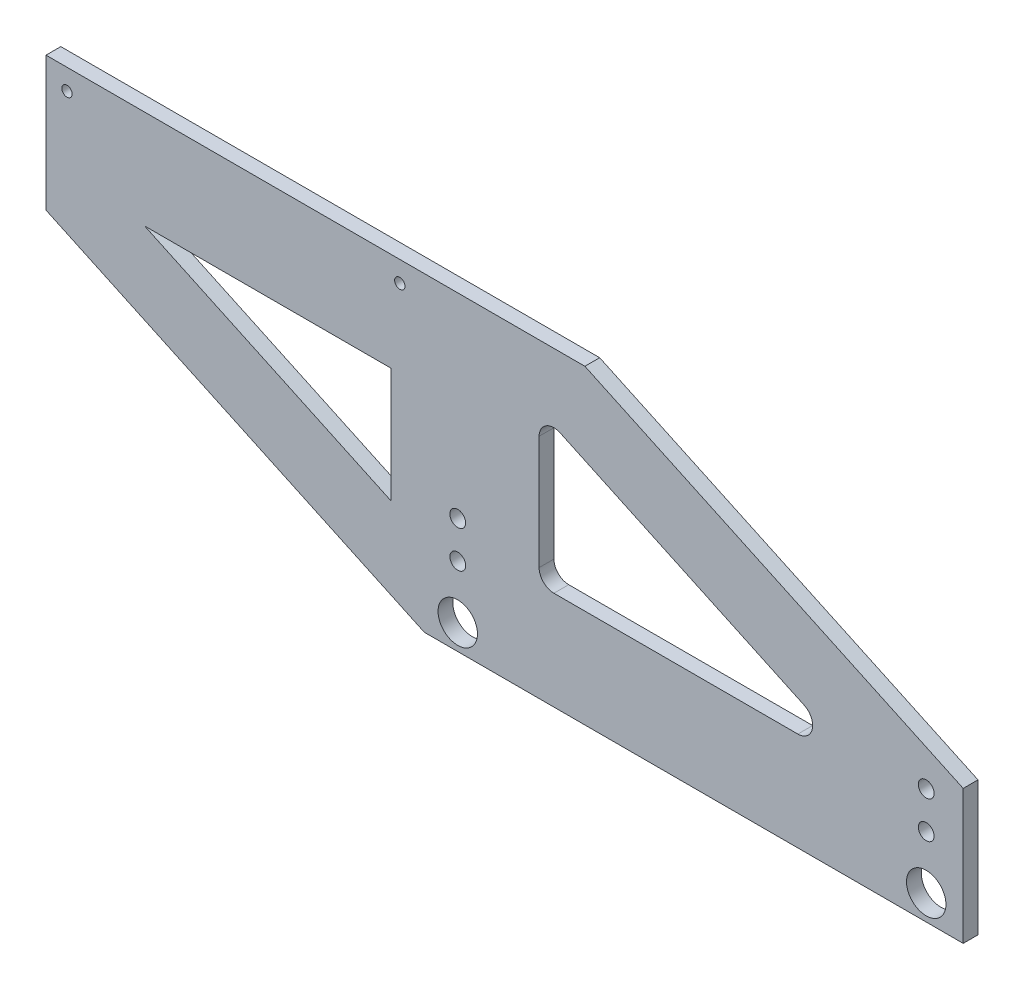
ISO-10303-21;
HEADER;
FILE_DESCRIPTION(('STEP AP214'),'2;1');
FILE_NAME('part.step','',(''),(''),'','','');
FILE_SCHEMA(('AUTOMOTIVE_DESIGN { 1 0 10303 214 1 1 1 1 }'));
ENDSEC;
DATA;
#1=APPLICATION_CONTEXT('core data for automotive mechanical design processes');
#2=APPLICATION_PROTOCOL_DEFINITION('international standard','automotive_design',2000,#1);
#3=PRODUCT_CONTEXT('',#1,'mechanical');
#4=PRODUCT('Part','Part','',(#3));
#5=PRODUCT_RELATED_PRODUCT_CATEGORY('part','',(#4));
#6=PRODUCT_DEFINITION_FORMATION('','',#4);
#7=PRODUCT_DEFINITION_CONTEXT('part definition',#1,'design');
#8=PRODUCT_DEFINITION('design','',#6,#7);
#9=PRODUCT_DEFINITION_SHAPE('','',#8);
#10=(LENGTH_UNIT() NAMED_UNIT(*) SI_UNIT(.MILLI.,.METRE.));
#11=(NAMED_UNIT(*) PLANE_ANGLE_UNIT() SI_UNIT($,.RADIAN.));
#12=(NAMED_UNIT(*) SI_UNIT($,.STERADIAN.) SOLID_ANGLE_UNIT());
#13=UNCERTAINTY_MEASURE_WITH_UNIT(LENGTH_MEASURE(1.E-05),#10,'distance_accuracy_value','');
#14=(GEOMETRIC_REPRESENTATION_CONTEXT(3) GLOBAL_UNCERTAINTY_ASSIGNED_CONTEXT((#13)) GLOBAL_UNIT_ASSIGNED_CONTEXT((#10,
#11,#12)) REPRESENTATION_CONTEXT('',''));
#15=CARTESIAN_POINT('',(0.,0.,0.));
#16=DIRECTION('',(0.,0.,1.));
#17=DIRECTION('',(1.,0.,0.));
#18=AXIS2_PLACEMENT_3D('',#15,#16,#17);
#19=CARTESIAN_POINT('',(0.,0.,3.));
#20=DIRECTION('',(0.,0.,1.));
#21=DIRECTION('',(1.,0.,0.));
#22=AXIS2_PLACEMENT_3D('',#19,#20,#21);
#23=PLANE('',#22);
#24=CARTESIAN_POINT('',(0.,34.4999999999958,3.));
#25=DIRECTION('',(0.,0.,1.));
#26=DIRECTION('',(1.,0.,0.));
#27=AXIS2_PLACEMENT_3D('',#24,#25,#26);
#28=CIRCLE('',#27,1.6);
#29=CARTESIAN_POINT('',(1.6,34.4999999999958,3.));
#30=VERTEX_POINT('',#29);
#31=EDGE_CURVE('E280',#30,#30,#28,.T.);
#32=ORIENTED_EDGE('',*,*,#31,.F.);
#33=EDGE_LOOP('',(#32));
#34=FACE_BOUND('',#33,.T.);
#35=CARTESIAN_POINT('',(95.,26.9999999999978,3.));
#36=DIRECTION('',(0.,0.,1.));
#37=DIRECTION('',(1.,0.,0.));
#38=AXIS2_PLACEMENT_3D('',#35,#36,#37);
#39=CIRCLE('',#38,1.6);
#40=CARTESIAN_POINT('',(96.6,26.9999999999978,3.));
#41=VERTEX_POINT('',#40);
#42=EDGE_CURVE('E292',#41,#41,#39,.T.);
#43=ORIENTED_EDGE('',*,*,#42,.F.);
#44=EDGE_LOOP('',(#43));
#45=FACE_BOUND('',#44,.T.);
#46=CARTESIAN_POINT('',(0.,16.2018540583964,3.));
#47=DIRECTION('',(0.,0.,1.));
#48=DIRECTION('',(1.,0.,0.));
#49=AXIS2_PLACEMENT_3D('',#46,#47,#48);
#50=CIRCLE('',#49,4.);
#51=CARTESIAN_POINT('',(4.,16.2018540583964,3.));
#52=VERTEX_POINT('',#51);
#53=EDGE_CURVE('E304',#52,#52,#50,.T.);
#54=ORIENTED_EDGE('',*,*,#53,.F.);
#55=EDGE_LOOP('',(#54));
#56=FACE_BOUND('',#55,.T.);
#57=CARTESIAN_POINT('',(-79.25,69.9154273187985,3.));
#58=DIRECTION('',(0.,0.,1.));
#59=DIRECTION('',(1.,0.,0.));
#60=AXIS2_PLACEMENT_3D('',#57,#58,#59);
#61=CIRCLE('',#60,1.04999999999999);
#62=CARTESIAN_POINT('',(-78.2,69.9154273187985,3.));
#63=VERTEX_POINT('',#62);
#64=EDGE_CURVE('E173',#63,#63,#61,.T.);
#65=ORIENTED_EDGE('',*,*,#64,.F.);
#66=EDGE_LOOP('',(#65));
#67=FACE_BOUND('',#66,.T.);
#68=DIRECTION('',(0.,-1.,0.));
#69=VECTOR('',#68,1.);
#70=CARTESIAN_POINT('',(-83.5000000000005,74.1154273187985,3.));
#71=LINE('',#70,#69);
#72=CARTESIAN_POINT('',(-83.5000000000005,74.1154273187985,3.));
#73=VERTEX_POINT('',#72);
#74=CARTESIAN_POINT('',(-83.5000000000005,46.8909116974611,3.));
#75=VERTEX_POINT('',#74);
#76=EDGE_CURVE('E179',#73,#75,#71,.T.);
#77=ORIENTED_EDGE('',*,*,#76,.T.);
#78=DIRECTION('',(0.906307787036651,-0.422618261740697,0.));
#79=VECTOR('',#78,1.);
#80=CARTESIAN_POINT('',(-83.5000000000005,46.8909116974611,3.));
#81=LINE('',#80,#79);
#82=CARTESIAN_POINT('',(-6.7792261653765,11.1154273187985,3.));
#83=VERTEX_POINT('',#82);
#84=EDGE_CURVE('E182',#75,#83,#81,.T.);
#85=ORIENTED_EDGE('',*,*,#84,.T.);
#86=DIRECTION('',(1.,0.,0.));
#87=VECTOR('',#86,1.);
#88=CARTESIAN_POINT('',(-6.7792261653765,11.1154273187985,3.));
#89=LINE('',#88,#87);
#90=CARTESIAN_POINT('',(102.5,11.1154273187985,3.));
#91=VERTEX_POINT('',#90);
#92=EDGE_CURVE('E185',#83,#91,#89,.T.);
#93=ORIENTED_EDGE('',*,*,#92,.T.);
#94=DIRECTION('',(0.,1.,0.));
#95=VECTOR('',#94,1.);
#96=CARTESIAN_POINT('',(102.5,38.3399429401359,3.));
#97=LINE('',#96,#95);
#98=CARTESIAN_POINT('',(102.5,38.3399429401359,3.));
#99=VERTEX_POINT('',#98);
#100=EDGE_CURVE('E187',#91,#99,#97,.T.);
#101=ORIENTED_EDGE('',*,*,#100,.T.);
#102=DIRECTION('',(-0.906307787036651,0.422618261740697,0.));
#103=VECTOR('',#102,1.);
#104=CARTESIAN_POINT('',(25.779226165376,74.1154273187985,3.));
#105=LINE('',#104,#103);
#106=CARTESIAN_POINT('',(25.779226165376,74.1154273187985,3.));
#107=VERTEX_POINT('',#106);
#108=EDGE_CURVE('E189',#99,#107,#105,.T.);
#109=ORIENTED_EDGE('',*,*,#108,.T.);
#110=DIRECTION('',(-1.,0.,0.));
#111=VECTOR('',#110,1.);
#112=CARTESIAN_POINT('',(-83.5000000000005,74.1154273187985,3.));
#113=LINE('',#112,#111);
#114=EDGE_CURVE('E191',#107,#73,#113,.T.);
#115=ORIENTED_EDGE('',*,*,#114,.T.);
#116=EDGE_LOOP('',(#77,#85,#93,#101,#109,#115));
#117=FACE_BOUND('',#116,.T.);
#118=DIRECTION('',(0.,1.,0.));
#119=VECTOR('',#118,1.);
#120=CARTESIAN_POINT('',(-13.5000000000005,54.1154273187985,3.));
#121=LINE('',#120,#119);
#122=CARTESIAN_POINT('',(-13.5000000000005,30.8000444110487,3.));
#123=VERTEX_POINT('',#122);
#124=CARTESIAN_POINT('',(-13.5000000000005,54.1154273187985,3.));
#125=VERTEX_POINT('',#124);
#126=EDGE_CURVE('E154',#123,#125,#121,.T.);
#127=ORIENTED_EDGE('',*,*,#126,.F.);
#128=DIRECTION('',(0.906307787036651,-0.422618261740697,0.));
#129=VECTOR('',#128,1.);
#130=CARTESIAN_POINT('',(-13.5000000000005,30.8000444110487,3.));
#131=LINE('',#130,#129);
#132=CARTESIAN_POINT('',(-63.5000000000005,54.1154273187985,3.));
#133=VERTEX_POINT('',#132);
#134=EDGE_CURVE('E144',#133,#123,#131,.T.);
#135=ORIENTED_EDGE('',*,*,#134,.F.);
#136=DIRECTION('',(-1.,0.,0.));
#137=VECTOR('',#136,1.);
#138=CARTESIAN_POINT('',(-63.5000000000005,54.1154273187985,3.));
#139=LINE('',#138,#137);
#140=EDGE_CURVE('E166',#125,#133,#139,.T.);
#141=ORIENTED_EDGE('',*,*,#140,.F.);
#142=EDGE_LOOP('',(#127,#135,#141));
#143=FACE_BOUND('',#142,.T.);
#144=CARTESIAN_POINT('',(-11.75,69.9154273187985,3.));
#145=DIRECTION('',(0.,0.,1.));
#146=DIRECTION('',(1.,0.,0.));
#147=AXIS2_PLACEMENT_3D('',#144,#145,#146);
#148=CIRCLE('',#147,1.05);
#149=CARTESIAN_POINT('',(-10.7,69.9154273187985,3.));
#150=VERTEX_POINT('',#149);
#151=EDGE_CURVE('E310',#150,#150,#148,.T.);
#152=ORIENTED_EDGE('',*,*,#151,.F.);
#153=EDGE_LOOP('',(#152));
#154=FACE_BOUND('',#153,.T.);
#155=CARTESIAN_POINT('',(95.,16.2018540583964,3.));
#156=DIRECTION('',(0.,0.,1.));
#157=DIRECTION('',(1.,0.,0.));
#158=AXIS2_PLACEMENT_3D('',#155,#156,#157);
#159=CIRCLE('',#158,4.00000000000001);
#160=CARTESIAN_POINT('',(99.,16.2018540583964,3.));
#161=VERTEX_POINT('',#160);
#162=EDGE_CURVE('E298',#161,#161,#159,.T.);
#163=ORIENTED_EDGE('',*,*,#162,.F.);
#164=EDGE_LOOP('',(#163));
#165=FACE_BOUND('',#164,.T.);
#166=CARTESIAN_POINT('',(95.,34.4999999999958,3.));
#167=DIRECTION('',(0.,0.,1.));
#168=DIRECTION('',(1.,0.,0.));
#169=AXIS2_PLACEMENT_3D('',#166,#167,#168);
#170=CIRCLE('',#169,1.60000000000001);
#171=CARTESIAN_POINT('',(96.6,34.4999999999958,3.));
#172=VERTEX_POINT('',#171);
#173=EDGE_CURVE('E286',#172,#172,#170,.T.);
#174=ORIENTED_EDGE('',*,*,#173,.F.);
#175=EDGE_LOOP('',(#174));
#176=FACE_BOUND('',#175,.T.);
#177=CARTESIAN_POINT('',(0.,26.9999999999978,3.));
#178=DIRECTION('',(0.,0.,1.));
#179=DIRECTION('',(1.,0.,0.));
#180=AXIS2_PLACEMENT_3D('',#177,#178,#179);
#181=CIRCLE('',#180,1.6);
#182=CARTESIAN_POINT('',(1.6,26.9999999999978,3.));
#183=VERTEX_POINT('',#182);
#184=EDGE_CURVE('E274',#183,#183,#181,.T.);
#185=ORIENTED_EDGE('',*,*,#184,.F.);
#186=EDGE_LOOP('',(#185));
#187=FACE_BOUND('',#186,.T.);
#188=DIRECTION('',(0.,-1.,0.));
#189=VECTOR('',#188,1.);
#190=CARTESIAN_POINT('',(16.4999999999995,61.8917327570284,3.));
#191=LINE('',#190,#189);
#192=CARTESIAN_POINT('',(16.4999999999995,57.182676025676,3.));
#193=VERTEX_POINT('',#192);
#194=CARTESIAN_POINT('',(16.4999999999995,34.1154273187985,3.));
#195=VERTEX_POINT('',#194);
#196=EDGE_CURVE('E261',#193,#195,#191,.T.);
#197=ORIENTED_EDGE('',*,*,#196,.F.);
#198=CARTESIAN_POINT('',(19.4999999999995,57.182676025676,3.));
#199=DIRECTION('',(0.,0.,1.));
#200=DIRECTION('',(1.,0.,0.));
#201=AXIS2_PLACEMENT_3D('',#198,#199,#200);
#202=CIRCLE('',#201,3.);
#203=CARTESIAN_POINT('',(20.7678547852216,59.9015993867859,3.));
#204=VERTEX_POINT('',#203);
#205=EDGE_CURVE('E11',#193,#204,#202,.F.);
#206=ORIENTED_EDGE('',*,*,#205,.T.);
#207=DIRECTION('',(-0.906307787036651,0.422618261740697,0.));
#208=VECTOR('',#207,1.);
#209=CARTESIAN_POINT('',(82.5,31.1154273187985,3.));
#210=LINE('',#209,#208);
#211=CARTESIAN_POINT('',(70.2357292742359,36.8343506799084,3.));
#212=VERTEX_POINT('',#211);
#213=EDGE_CURVE('E259',#212,#204,#210,.T.);
#214=ORIENTED_EDGE('',*,*,#213,.F.);
#215=CARTESIAN_POINT('',(68.9678744890138,34.1154273187985,3.));
#216=DIRECTION('',(0.,0.,1.));
#217=DIRECTION('',(1.,0.,0.));
#218=AXIS2_PLACEMENT_3D('',#215,#216,#217);
#219=CIRCLE('',#218,3.);
#220=CARTESIAN_POINT('',(68.9678744890138,31.1154273187985,3.));
#221=VERTEX_POINT('',#220);
#222=EDGE_CURVE('E238',#212,#221,#219,.F.);
#223=ORIENTED_EDGE('',*,*,#222,.T.);
#224=DIRECTION('',(1.,0.,0.));
#225=VECTOR('',#224,1.);
#226=CARTESIAN_POINT('',(16.4999999999995,31.1154273187985,3.));
#227=LINE('',#226,#225);
#228=CARTESIAN_POINT('',(19.4999999999995,31.1154273187985,3.));
#229=VERTEX_POINT('',#228);
#230=EDGE_CURVE('E266',#229,#221,#227,.T.);
#231=ORIENTED_EDGE('',*,*,#230,.F.);
#232=CARTESIAN_POINT('',(19.4999999999995,34.1154273187985,3.));
#233=DIRECTION('',(0.,0.,1.));
#234=DIRECTION('',(1.,0.,0.));
#235=AXIS2_PLACEMENT_3D('',#232,#233,#234);
#236=CIRCLE('',#235,3.);
#237=EDGE_CURVE('E50',#229,#195,#236,.F.);
#238=ORIENTED_EDGE('',*,*,#237,.T.);
#239=EDGE_LOOP('',(#197,#206,#214,#223,#231,#238));
#240=FACE_BOUND('',#239,.T.);
#241=ADVANCED_FACE('F35',(#34,#45,#56,#67,#117,#143,#154,#165,#176,#187,#240),#23,.T.);
#242=CARTESIAN_POINT('',(0.,0.,0.));
#243=DIRECTION('',(0.,0.,1.));
#244=DIRECTION('',(1.,0.,0.));
#245=AXIS2_PLACEMENT_3D('',#242,#243,#244);
#246=PLANE('',#245);
#247=CARTESIAN_POINT('',(0.,26.9999999999978,0.));
#248=DIRECTION('',(0.,0.,1.));
#249=DIRECTION('',(1.,0.,0.));
#250=AXIS2_PLACEMENT_3D('',#247,#248,#249);
#251=CIRCLE('',#250,1.6);
#252=CARTESIAN_POINT('',(1.6,26.9999999999978,0.));
#253=VERTEX_POINT('',#252);
#254=EDGE_CURVE('E272',#253,#253,#251,.T.);
#255=ORIENTED_EDGE('',*,*,#254,.T.);
#256=EDGE_LOOP('',(#255));
#257=FACE_BOUND('',#256,.T.);
#258=CARTESIAN_POINT('',(0.,34.4999999999958,0.));
#259=DIRECTION('',(0.,0.,1.));
#260=DIRECTION('',(1.,0.,0.));
#261=AXIS2_PLACEMENT_3D('',#258,#259,#260);
#262=CIRCLE('',#261,1.6);
#263=CARTESIAN_POINT('',(1.6,34.4999999999958,0.));
#264=VERTEX_POINT('',#263);
#265=EDGE_CURVE('E277',#264,#264,#262,.T.);
#266=ORIENTED_EDGE('',*,*,#265,.T.);
#267=EDGE_LOOP('',(#266));
#268=FACE_BOUND('',#267,.T.);
#269=CARTESIAN_POINT('',(95.,34.4999999999958,0.));
#270=DIRECTION('',(0.,0.,1.));
#271=DIRECTION('',(1.,0.,0.));
#272=AXIS2_PLACEMENT_3D('',#269,#270,#271);
#273=CIRCLE('',#272,1.60000000000001);
#274=CARTESIAN_POINT('',(96.6,34.4999999999958,0.));
#275=VERTEX_POINT('',#274);
#276=EDGE_CURVE('E283',#275,#275,#273,.T.);
#277=ORIENTED_EDGE('',*,*,#276,.T.);
#278=EDGE_LOOP('',(#277));
#279=FACE_BOUND('',#278,.T.);
#280=CARTESIAN_POINT('',(95.,26.9999999999978,0.));
#281=DIRECTION('',(0.,0.,1.));
#282=DIRECTION('',(1.,0.,0.));
#283=AXIS2_PLACEMENT_3D('',#280,#281,#282);
#284=CIRCLE('',#283,1.6);
#285=CARTESIAN_POINT('',(96.6,26.9999999999978,0.));
#286=VERTEX_POINT('',#285);
#287=EDGE_CURVE('E289',#286,#286,#284,.T.);
#288=ORIENTED_EDGE('',*,*,#287,.T.);
#289=EDGE_LOOP('',(#288));
#290=FACE_BOUND('',#289,.T.);
#291=CARTESIAN_POINT('',(95.,16.2018540583964,0.));
#292=DIRECTION('',(0.,0.,1.));
#293=DIRECTION('',(1.,0.,0.));
#294=AXIS2_PLACEMENT_3D('',#291,#292,#293);
#295=CIRCLE('',#294,4.00000000000001);
#296=CARTESIAN_POINT('',(99.,16.2018540583964,0.));
#297=VERTEX_POINT('',#296);
#298=EDGE_CURVE('E295',#297,#297,#295,.T.);
#299=ORIENTED_EDGE('',*,*,#298,.T.);
#300=EDGE_LOOP('',(#299));
#301=FACE_BOUND('',#300,.T.);
#302=CARTESIAN_POINT('',(0.,16.2018540583964,0.));
#303=DIRECTION('',(0.,0.,1.));
#304=DIRECTION('',(1.,0.,0.));
#305=AXIS2_PLACEMENT_3D('',#302,#303,#304);
#306=CIRCLE('',#305,4.);
#307=CARTESIAN_POINT('',(4.,16.2018540583964,0.));
#308=VERTEX_POINT('',#307);
#309=EDGE_CURVE('E301',#308,#308,#306,.T.);
#310=ORIENTED_EDGE('',*,*,#309,.T.);
#311=EDGE_LOOP('',(#310));
#312=FACE_BOUND('',#311,.T.);
#313=CARTESIAN_POINT('',(-11.75,69.9154273187985,0.));
#314=DIRECTION('',(0.,0.,1.));
#315=DIRECTION('',(1.,0.,0.));
#316=AXIS2_PLACEMENT_3D('',#313,#314,#315);
#317=CIRCLE('',#316,1.05);
#318=CARTESIAN_POINT('',(-10.7,69.9154273187985,0.));
#319=VERTEX_POINT('',#318);
#320=EDGE_CURVE('E307',#319,#319,#317,.T.);
#321=ORIENTED_EDGE('',*,*,#320,.T.);
#322=EDGE_LOOP('',(#321));
#323=FACE_BOUND('',#322,.T.);
#324=CARTESIAN_POINT('',(-79.25,69.9154273187985,0.));
#325=DIRECTION('',(0.,0.,1.));
#326=DIRECTION('',(1.,0.,0.));
#327=AXIS2_PLACEMENT_3D('',#324,#325,#326);
#328=CIRCLE('',#327,1.04999999999999);
#329=CARTESIAN_POINT('',(-78.2,69.9154273187985,0.));
#330=VERTEX_POINT('',#329);
#331=EDGE_CURVE('E313',#330,#330,#328,.T.);
#332=ORIENTED_EDGE('',*,*,#331,.T.);
#333=EDGE_LOOP('',(#332));
#334=FACE_BOUND('',#333,.T.);
#335=DIRECTION('',(0.906307787036651,-0.422618261740697,0.));
#336=VECTOR('',#335,1.);
#337=CARTESIAN_POINT('',(-13.5000000000005,30.8000444110487,0.));
#338=LINE('',#337,#336);
#339=CARTESIAN_POINT('',(-63.5000000000005,54.1154273187985,0.));
#340=VERTEX_POINT('',#339);
#341=CARTESIAN_POINT('',(-13.5000000000005,30.8000444110487,0.));
#342=VERTEX_POINT('',#341);
#343=EDGE_CURVE('E171',#340,#342,#338,.T.);
#344=ORIENTED_EDGE('',*,*,#343,.T.);
#345=DIRECTION('',(0.,1.,0.));
#346=VECTOR('',#345,1.);
#347=CARTESIAN_POINT('',(-13.5000000000005,54.1154273187985,0.));
#348=LINE('',#347,#346);
#349=CARTESIAN_POINT('',(-13.5000000000005,54.1154273187985,0.));
#350=VERTEX_POINT('',#349);
#351=EDGE_CURVE('E161',#342,#350,#348,.T.);
#352=ORIENTED_EDGE('',*,*,#351,.T.);
#353=DIRECTION('',(-1.,0.,0.));
#354=VECTOR('',#353,1.);
#355=CARTESIAN_POINT('',(-63.5000000000005,54.1154273187985,0.));
#356=LINE('',#355,#354);
#357=EDGE_CURVE('E155',#350,#340,#356,.T.);
#358=ORIENTED_EDGE('',*,*,#357,.T.);
#359=EDGE_LOOP('',(#344,#352,#358));
#360=FACE_BOUND('',#359,.T.);
#361=DIRECTION('',(0.,-1.,0.));
#362=VECTOR('',#361,1.);
#363=CARTESIAN_POINT('',(-83.5000000000005,74.1154273187985,0.));
#364=LINE('',#363,#362);
#365=CARTESIAN_POINT('',(-83.5000000000005,74.1154273187985,0.));
#366=VERTEX_POINT('',#365);
#367=CARTESIAN_POINT('',(-83.5000000000005,46.8909116974611,0.));
#368=VERTEX_POINT('',#367);
#369=EDGE_CURVE('E162',#366,#368,#364,.T.);
#370=ORIENTED_EDGE('',*,*,#369,.F.);
#371=DIRECTION('',(-1.,0.,0.));
#372=VECTOR('',#371,1.);
#373=CARTESIAN_POINT('',(-83.5000000000005,74.1154273187985,0.));
#374=LINE('',#373,#372);
#375=CARTESIAN_POINT('',(25.779226165376,74.1154273187985,0.));
#376=VERTEX_POINT('',#375);
#377=EDGE_CURVE('E183',#376,#366,#374,.T.);
#378=ORIENTED_EDGE('',*,*,#377,.F.);
#379=DIRECTION('',(-0.906307787036651,0.422618261740697,0.));
#380=VECTOR('',#379,1.);
#381=CARTESIAN_POINT('',(25.779226165376,74.1154273187985,0.));
#382=LINE('',#381,#380);
#383=CARTESIAN_POINT('',(102.5,38.3399429401359,0.));
#384=VERTEX_POINT('',#383);
#385=EDGE_CURVE('E202',#384,#376,#382,.T.);
#386=ORIENTED_EDGE('',*,*,#385,.F.);
#387=DIRECTION('',(0.,1.,0.));
#388=VECTOR('',#387,1.);
#389=CARTESIAN_POINT('',(102.5,38.3399429401359,0.));
#390=LINE('',#389,#388);
#391=CARTESIAN_POINT('',(102.5,11.1154273187985,0.));
#392=VERTEX_POINT('',#391);
#393=EDGE_CURVE('E200',#392,#384,#390,.T.);
#394=ORIENTED_EDGE('',*,*,#393,.F.);
#395=DIRECTION('',(1.,0.,0.));
#396=VECTOR('',#395,1.);
#397=CARTESIAN_POINT('',(-6.7792261653765,11.1154273187985,0.));
#398=LINE('',#397,#396);
#399=CARTESIAN_POINT('',(-6.7792261653765,11.1154273187985,0.));
#400=VERTEX_POINT('',#399);
#401=EDGE_CURVE('E198',#400,#392,#398,.T.);
#402=ORIENTED_EDGE('',*,*,#401,.F.);
#403=DIRECTION('',(0.906307787036651,-0.422618261740697,0.));
#404=VECTOR('',#403,1.);
#405=CARTESIAN_POINT('',(-83.5000000000005,46.8909116974611,0.));
#406=LINE('',#405,#404);
#407=EDGE_CURVE('E196',#368,#400,#406,.T.);
#408=ORIENTED_EDGE('',*,*,#407,.F.);
#409=EDGE_LOOP('',(#370,#378,#386,#394,#402,#408));
#410=FACE_BOUND('',#409,.T.);
#411=DIRECTION('',(1.,0.,0.));
#412=VECTOR('',#411,1.);
#413=CARTESIAN_POINT('',(16.4999999999995,31.1154273187985,0.));
#414=LINE('',#413,#412);
#415=CARTESIAN_POINT('',(19.4999999999995,31.1154273187985,0.));
#416=VERTEX_POINT('',#415);
#417=CARTESIAN_POINT('',(68.9678744890138,31.1154273187985,0.));
#418=VERTEX_POINT('',#417);
#419=EDGE_CURVE('E254',#416,#418,#414,.T.);
#420=ORIENTED_EDGE('',*,*,#419,.T.);
#421=CARTESIAN_POINT('',(68.9678744890138,34.1154273187985,0.));
#422=DIRECTION('',(0.,0.,1.));
#423=DIRECTION('',(1.,0.,0.));
#424=AXIS2_PLACEMENT_3D('',#421,#422,#423);
#425=CIRCLE('',#424,3.);
#426=CARTESIAN_POINT('',(70.2357292742359,36.8343506799084,0.));
#427=VERTEX_POINT('',#426);
#428=EDGE_CURVE('E236',#418,#427,#425,.T.);
#429=ORIENTED_EDGE('',*,*,#428,.T.);
#430=DIRECTION('',(-0.906307787036651,0.422618261740697,0.));
#431=VECTOR('',#430,1.);
#432=CARTESIAN_POINT('',(82.5,31.1154273187985,0.));
#433=LINE('',#432,#431);
#434=CARTESIAN_POINT('',(20.7678547852216,59.9015993867859,0.));
#435=VERTEX_POINT('',#434);
#436=EDGE_CURVE('E249',#427,#435,#433,.T.);
#437=ORIENTED_EDGE('',*,*,#436,.T.);
#438=CARTESIAN_POINT('',(19.4999999999995,57.182676025676,0.));
#439=DIRECTION('',(0.,0.,1.));
#440=DIRECTION('',(1.,0.,0.));
#441=AXIS2_PLACEMENT_3D('',#438,#439,#440);
#442=CIRCLE('',#441,3.);
#443=CARTESIAN_POINT('',(16.4999999999995,57.182676025676,0.));
#444=VERTEX_POINT('',#443);
#445=EDGE_CURVE('E43',#435,#444,#442,.T.);
#446=ORIENTED_EDGE('',*,*,#445,.T.);
#447=DIRECTION('',(0.,-1.,0.));
#448=VECTOR('',#447,1.);
#449=CARTESIAN_POINT('',(16.4999999999995,61.8917327570284,0.));
#450=LINE('',#449,#448);
#451=CARTESIAN_POINT('',(16.4999999999995,34.1154273187985,0.));
#452=VERTEX_POINT('',#451);
#453=EDGE_CURVE('E247',#444,#452,#450,.T.);
#454=ORIENTED_EDGE('',*,*,#453,.T.);
#455=CARTESIAN_POINT('',(19.4999999999995,34.1154273187985,0.));
#456=DIRECTION('',(0.,0.,1.));
#457=DIRECTION('',(1.,0.,0.));
#458=AXIS2_PLACEMENT_3D('',#455,#456,#457);
#459=CIRCLE('',#458,3.);
#460=EDGE_CURVE('E240',#452,#416,#459,.T.);
#461=ORIENTED_EDGE('',*,*,#460,.T.);
#462=EDGE_LOOP('',(#420,#429,#437,#446,#454,#461));
#463=FACE_BOUND('',#462,.T.);
#464=ADVANCED_FACE('F246',(#257,#268,#279,#290,#301,#312,#323,#334,#360,#410,#463),#246,.F.);
#465=CARTESIAN_POINT('',(-83.5000000000005,74.1154273187985,3.));
#466=DIRECTION('',(1.,0.,0.));
#467=DIRECTION('',(0.,0.,-1.));
#468=AXIS2_PLACEMENT_3D('',#465,#466,#467);
#469=PLANE('',#468);
#470=ORIENTED_EDGE('',*,*,#369,.T.);
#471=DIRECTION('',(0.,0.,-1.));
#472=VECTOR('',#471,1.);
#473=CARTESIAN_POINT('',(-83.5000000000005,46.8909116974611,3.));
#474=LINE('',#473,#472);
#475=EDGE_CURVE('E219',#75,#368,#474,.T.);
#476=ORIENTED_EDGE('',*,*,#475,.F.);
#477=ORIENTED_EDGE('',*,*,#76,.F.);
#478=DIRECTION('',(0.,0.,-1.));
#479=VECTOR('',#478,1.);
#480=CARTESIAN_POINT('',(-83.5000000000005,74.1154273187985,3.));
#481=LINE('',#480,#479);
#482=EDGE_CURVE('E193',#73,#366,#481,.T.);
#483=ORIENTED_EDGE('',*,*,#482,.T.);
#484=EDGE_LOOP('',(#470,#476,#477,#483));
#485=FACE_BOUND('',#484,.T.);
#486=ADVANCED_FACE('F344',(#485),#469,.F.);
#487=CARTESIAN_POINT('',(-83.5000000000005,46.8909116974611,3.));
#488=DIRECTION('',(0.422618261740697,0.906307787036651,0.));
#489=DIRECTION('',(-0.906307787036651,0.422618261740697,0.));
#490=AXIS2_PLACEMENT_3D('',#487,#488,#489);
#491=PLANE('',#490);
#492=ORIENTED_EDGE('',*,*,#407,.T.);
#493=DIRECTION('',(0.,0.,-1.));
#494=VECTOR('',#493,1.);
#495=CARTESIAN_POINT('',(-6.7792261653765,11.1154273187985,3.));
#496=LINE('',#495,#494);
#497=EDGE_CURVE('E216',#83,#400,#496,.T.);
#498=ORIENTED_EDGE('',*,*,#497,.F.);
#499=ORIENTED_EDGE('',*,*,#84,.F.);
#500=ORIENTED_EDGE('',*,*,#475,.T.);
#501=EDGE_LOOP('',(#492,#498,#499,#500));
#502=FACE_BOUND('',#501,.T.);
#503=ADVANCED_FACE('F367',(#502),#491,.F.);
#504=CARTESIAN_POINT('',(-6.7792261653765,11.1154273187985,3.));
#505=DIRECTION('',(0.,1.,0.));
#506=DIRECTION('',(0.,0.,1.));
#507=AXIS2_PLACEMENT_3D('',#504,#505,#506);
#508=PLANE('',#507);
#509=ORIENTED_EDGE('',*,*,#401,.T.);
#510=DIRECTION('',(0.,0.,-1.));
#511=VECTOR('',#510,1.);
#512=CARTESIAN_POINT('',(102.5,11.1154273187985,3.));
#513=LINE('',#512,#511);
#514=EDGE_CURVE('E213',#91,#392,#513,.T.);
#515=ORIENTED_EDGE('',*,*,#514,.F.);
#516=ORIENTED_EDGE('',*,*,#92,.F.);
#517=ORIENTED_EDGE('',*,*,#497,.T.);
#518=EDGE_LOOP('',(#509,#515,#516,#517));
#519=FACE_BOUND('',#518,.T.);
#520=ADVANCED_FACE('F363',(#519),#508,.F.);
#521=CARTESIAN_POINT('',(102.5,38.3399429401359,3.));
#522=DIRECTION('',(-1.,0.,0.));
#523=DIRECTION('',(0.,-1.,0.));
#524=AXIS2_PLACEMENT_3D('',#521,#522,#523);
#525=PLANE('',#524);
#526=ORIENTED_EDGE('',*,*,#393,.T.);
#527=DIRECTION('',(0.,0.,-1.));
#528=VECTOR('',#527,1.);
#529=CARTESIAN_POINT('',(102.5,38.3399429401359,3.));
#530=LINE('',#529,#528);
#531=EDGE_CURVE('E210',#99,#384,#530,.T.);
#532=ORIENTED_EDGE('',*,*,#531,.F.);
#533=ORIENTED_EDGE('',*,*,#100,.F.);
#534=ORIENTED_EDGE('',*,*,#514,.T.);
#535=EDGE_LOOP('',(#526,#532,#533,#534));
#536=FACE_BOUND('',#535,.T.);
#537=ADVANCED_FACE('F359',(#536),#525,.F.);
#538=CARTESIAN_POINT('',(25.779226165376,74.1154273187985,3.));
#539=DIRECTION('',(-0.422618261740697,-0.906307787036651,0.));
#540=DIRECTION('',(0.906307787036651,-0.422618261740697,0.));
#541=AXIS2_PLACEMENT_3D('',#538,#539,#540);
#542=PLANE('',#541);
#543=ORIENTED_EDGE('',*,*,#385,.T.);
#544=DIRECTION('',(0.,0.,-1.));
#545=VECTOR('',#544,1.);
#546=CARTESIAN_POINT('',(25.779226165376,74.1154273187985,3.));
#547=LINE('',#546,#545);
#548=EDGE_CURVE('E207',#107,#376,#547,.T.);
#549=ORIENTED_EDGE('',*,*,#548,.F.);
#550=ORIENTED_EDGE('',*,*,#108,.F.);
#551=ORIENTED_EDGE('',*,*,#531,.T.);
#552=EDGE_LOOP('',(#543,#549,#550,#551));
#553=FACE_BOUND('',#552,.T.);
#554=ADVANCED_FACE('F355',(#553),#542,.F.);
#555=CARTESIAN_POINT('',(-83.5000000000005,74.1154273187985,3.));
#556=DIRECTION('',(0.,-1.,0.));
#557=DIRECTION('',(0.,0.,-1.));
#558=AXIS2_PLACEMENT_3D('',#555,#556,#557);
#559=PLANE('',#558);
#560=ORIENTED_EDGE('',*,*,#377,.T.);
#561=ORIENTED_EDGE('',*,*,#482,.F.);
#562=ORIENTED_EDGE('',*,*,#114,.F.);
#563=ORIENTED_EDGE('',*,*,#548,.T.);
#564=EDGE_LOOP('',(#560,#561,#562,#563));
#565=FACE_BOUND('',#564,.T.);
#566=ADVANCED_FACE('F352',(#565),#559,.F.);
#567=CARTESIAN_POINT('',(-13.5000000000005,30.8000444110487,3.));
#568=DIRECTION('',(0.422618261740697,0.906307787036651,0.));
#569=DIRECTION('',(-0.906307787036651,0.422618261740697,0.));
#570=AXIS2_PLACEMENT_3D('',#567,#568,#569);
#571=PLANE('',#570);
#572=ORIENTED_EDGE('',*,*,#343,.F.);
#573=DIRECTION('',(0.,0.,-1.));
#574=VECTOR('',#573,1.);
#575=CARTESIAN_POINT('',(-63.5000000000005,54.1154273187985,3.));
#576=LINE('',#575,#574);
#577=EDGE_CURVE('E150',#133,#340,#576,.T.);
#578=ORIENTED_EDGE('',*,*,#577,.F.);
#579=ORIENTED_EDGE('',*,*,#134,.T.);
#580=DIRECTION('',(0.,0.,-1.));
#581=VECTOR('',#580,1.);
#582=CARTESIAN_POINT('',(-13.5000000000005,30.8000444110487,3.));
#583=LINE('',#582,#581);
#584=EDGE_CURVE('E147',#123,#342,#583,.T.);
#585=ORIENTED_EDGE('',*,*,#584,.T.);
#586=EDGE_LOOP('',(#572,#578,#579,#585));
#587=FACE_BOUND('',#586,.T.);
#588=ADVANCED_FACE('F146',(#587),#571,.T.);
#589=CARTESIAN_POINT('',(-13.5000000000005,54.1154273187985,3.));
#590=DIRECTION('',(-1.,0.,0.));
#591=DIRECTION('',(0.,-1.,0.));
#592=AXIS2_PLACEMENT_3D('',#589,#590,#591);
#593=PLANE('',#592);
#594=ORIENTED_EDGE('',*,*,#351,.F.);
#595=ORIENTED_EDGE('',*,*,#584,.F.);
#596=ORIENTED_EDGE('',*,*,#126,.T.);
#597=DIRECTION('',(0.,0.,-1.));
#598=VECTOR('',#597,1.);
#599=CARTESIAN_POINT('',(-13.5000000000005,54.1154273187985,3.));
#600=LINE('',#599,#598);
#601=EDGE_CURVE('E163',#125,#350,#600,.T.);
#602=ORIENTED_EDGE('',*,*,#601,.T.);
#603=EDGE_LOOP('',(#594,#595,#596,#602));
#604=FACE_BOUND('',#603,.T.);
#605=ADVANCED_FACE('F159',(#604),#593,.T.);
#606=CARTESIAN_POINT('',(-63.5000000000005,54.1154273187985,3.));
#607=DIRECTION('',(0.,-1.,0.));
#608=DIRECTION('',(1.,0.,0.));
#609=AXIS2_PLACEMENT_3D('',#606,#607,#608);
#610=PLANE('',#609);
#611=ORIENTED_EDGE('',*,*,#357,.F.);
#612=ORIENTED_EDGE('',*,*,#601,.F.);
#613=ORIENTED_EDGE('',*,*,#140,.T.);
#614=ORIENTED_EDGE('',*,*,#577,.T.);
#615=EDGE_LOOP('',(#611,#612,#613,#614));
#616=FACE_BOUND('',#615,.T.);
#617=ADVANCED_FACE('F325',(#616),#610,.T.);
#618=CARTESIAN_POINT('',(-79.25,69.9154273187985,3.));
#619=DIRECTION('',(0.,0.,-1.));
#620=DIRECTION('',(-1.,0.,0.));
#621=AXIS2_PLACEMENT_3D('',#618,#619,#620);
#622=CYLINDRICAL_SURFACE('',#621,1.04999999999999);
#623=ORIENTED_EDGE('',*,*,#64,.T.);
#624=EDGE_LOOP('',(#623));
#625=FACE_BOUND('',#624,.T.);
#626=ORIENTED_EDGE('',*,*,#331,.F.);
#627=EDGE_LOOP('',(#626));
#628=FACE_BOUND('',#627,.T.);
#629=ADVANCED_FACE('F322',(#625,#628),#622,.F.);
#630=CARTESIAN_POINT('',(-11.75,69.9154273187985,3.));
#631=DIRECTION('',(0.,0.,-1.));
#632=DIRECTION('',(-1.,0.,0.));
#633=AXIS2_PLACEMENT_3D('',#630,#631,#632);
#634=CYLINDRICAL_SURFACE('',#633,1.05);
#635=ORIENTED_EDGE('',*,*,#151,.T.);
#636=EDGE_LOOP('',(#635));
#637=FACE_BOUND('',#636,.T.);
#638=ORIENTED_EDGE('',*,*,#320,.F.);
#639=EDGE_LOOP('',(#638));
#640=FACE_BOUND('',#639,.T.);
#641=ADVANCED_FACE('F324',(#637,#640),#634,.F.);
#642=CARTESIAN_POINT('',(0.,16.2018540583964,3.));
#643=DIRECTION('',(0.,0.,-1.));
#644=DIRECTION('',(-1.,0.,0.));
#645=AXIS2_PLACEMENT_3D('',#642,#643,#644);
#646=CYLINDRICAL_SURFACE('',#645,4.);
#647=ORIENTED_EDGE('',*,*,#53,.T.);
#648=EDGE_LOOP('',(#647));
#649=FACE_BOUND('',#648,.T.);
#650=ORIENTED_EDGE('',*,*,#309,.F.);
#651=EDGE_LOOP('',(#650));
#652=FACE_BOUND('',#651,.T.);
#653=ADVANCED_FACE('F332',(#649,#652),#646,.F.);
#654=CARTESIAN_POINT('',(95.,16.2018540583964,3.));
#655=DIRECTION('',(0.,0.,-1.));
#656=DIRECTION('',(-1.,0.,0.));
#657=AXIS2_PLACEMENT_3D('',#654,#655,#656);
#658=CYLINDRICAL_SURFACE('',#657,4.00000000000001);
#659=ORIENTED_EDGE('',*,*,#162,.T.);
#660=EDGE_LOOP('',(#659));
#661=FACE_BOUND('',#660,.T.);
#662=ORIENTED_EDGE('',*,*,#298,.F.);
#663=EDGE_LOOP('',(#662));
#664=FACE_BOUND('',#663,.T.);
#665=ADVANCED_FACE('F414',(#661,#664),#658,.F.);
#666=CARTESIAN_POINT('',(95.,26.9999999999978,3.));
#667=DIRECTION('',(0.,0.,-1.));
#668=DIRECTION('',(-1.,0.,0.));
#669=AXIS2_PLACEMENT_3D('',#666,#667,#668);
#670=CYLINDRICAL_SURFACE('',#669,1.6);
#671=ORIENTED_EDGE('',*,*,#42,.T.);
#672=EDGE_LOOP('',(#671));
#673=FACE_BOUND('',#672,.T.);
#674=ORIENTED_EDGE('',*,*,#287,.F.);
#675=EDGE_LOOP('',(#674));
#676=FACE_BOUND('',#675,.T.);
#677=ADVANCED_FACE('F410',(#673,#676),#670,.F.);
#678=CARTESIAN_POINT('',(95.,34.4999999999958,3.));
#679=DIRECTION('',(0.,0.,-1.));
#680=DIRECTION('',(-1.,0.,0.));
#681=AXIS2_PLACEMENT_3D('',#678,#679,#680);
#682=CYLINDRICAL_SURFACE('',#681,1.60000000000001);
#683=ORIENTED_EDGE('',*,*,#173,.T.);
#684=EDGE_LOOP('',(#683));
#685=FACE_BOUND('',#684,.T.);
#686=ORIENTED_EDGE('',*,*,#276,.F.);
#687=EDGE_LOOP('',(#686));
#688=FACE_BOUND('',#687,.T.);
#689=ADVANCED_FACE('F406',(#685,#688),#682,.F.);
#690=CARTESIAN_POINT('',(0.,34.4999999999958,3.));
#691=DIRECTION('',(0.,0.,-1.));
#692=DIRECTION('',(-1.,0.,0.));
#693=AXIS2_PLACEMENT_3D('',#690,#691,#692);
#694=CYLINDRICAL_SURFACE('',#693,1.6);
#695=ORIENTED_EDGE('',*,*,#31,.T.);
#696=EDGE_LOOP('',(#695));
#697=FACE_BOUND('',#696,.T.);
#698=ORIENTED_EDGE('',*,*,#265,.F.);
#699=EDGE_LOOP('',(#698));
#700=FACE_BOUND('',#699,.T.);
#701=ADVANCED_FACE('F402',(#697,#700),#694,.F.);
#702=CARTESIAN_POINT('',(0.,26.9999999999978,3.));
#703=DIRECTION('',(0.,0.,-1.));
#704=DIRECTION('',(-1.,0.,0.));
#705=AXIS2_PLACEMENT_3D('',#702,#703,#704);
#706=CYLINDRICAL_SURFACE('',#705,1.6);
#707=ORIENTED_EDGE('',*,*,#184,.T.);
#708=EDGE_LOOP('',(#707));
#709=FACE_BOUND('',#708,.T.);
#710=ORIENTED_EDGE('',*,*,#254,.F.);
#711=EDGE_LOOP('',(#710));
#712=FACE_BOUND('',#711,.T.);
#713=ADVANCED_FACE('F399',(#709,#712),#706,.F.);
#714=CARTESIAN_POINT('',(82.5,31.1154273187985,3.));
#715=DIRECTION('',(-0.422618261740697,-0.906307787036651,0.));
#716=DIRECTION('',(0.906307787036651,-0.422618261740697,0.));
#717=AXIS2_PLACEMENT_3D('',#714,#715,#716);
#718=PLANE('',#717);
#719=ORIENTED_EDGE('',*,*,#436,.F.);
#720=DIRECTION('',(0.,0.,-1.));
#721=VECTOR('',#720,1.);
#722=CARTESIAN_POINT('',(70.2357292742359,36.8343506799084,3.));
#723=LINE('',#722,#721);
#724=EDGE_CURVE('E230',#427,#212,#723,.F.);
#725=ORIENTED_EDGE('',*,*,#724,.T.);
#726=ORIENTED_EDGE('',*,*,#213,.T.);
#727=DIRECTION('',(0.,0.,-1.));
#728=VECTOR('',#727,1.);
#729=CARTESIAN_POINT('',(20.7678547852216,59.9015993867859,0.));
#730=LINE('',#729,#728);
#731=EDGE_CURVE('E227',#204,#435,#730,.T.);
#732=ORIENTED_EDGE('',*,*,#731,.T.);
#733=EDGE_LOOP('',(#719,#725,#726,#732));
#734=FACE_BOUND('',#733,.T.);
#735=ADVANCED_FACE('F263',(#734),#718,.T.);
#736=CARTESIAN_POINT('',(16.4999999999995,61.8917327570284,3.));
#737=DIRECTION('',(1.,0.,0.));
#738=DIRECTION('',(0.,1.,0.));
#739=AXIS2_PLACEMENT_3D('',#736,#737,#738);
#740=PLANE('',#739);
#741=ORIENTED_EDGE('',*,*,#196,.T.);
#742=DIRECTION('',(0.,0.,-1.));
#743=VECTOR('',#742,1.);
#744=CARTESIAN_POINT('',(16.4999999999995,34.1154273187985,0.));
#745=LINE('',#744,#743);
#746=EDGE_CURVE('E233',#195,#452,#745,.T.);
#747=ORIENTED_EDGE('',*,*,#746,.T.);
#748=ORIENTED_EDGE('',*,*,#453,.F.);
#749=DIRECTION('',(0.,0.,-1.));
#750=VECTOR('',#749,1.);
#751=CARTESIAN_POINT('',(16.4999999999995,57.182676025676,3.));
#752=LINE('',#751,#750);
#753=EDGE_CURVE('E57',#444,#193,#752,.F.);
#754=ORIENTED_EDGE('',*,*,#753,.T.);
#755=EDGE_LOOP('',(#741,#747,#748,#754));
#756=FACE_BOUND('',#755,.T.);
#757=ADVANCED_FACE('F252',(#756),#740,.T.);
#758=CARTESIAN_POINT('',(16.4999999999995,31.1154273187985,3.));
#759=DIRECTION('',(0.,1.,0.));
#760=DIRECTION('',(0.,0.,1.));
#761=AXIS2_PLACEMENT_3D('',#758,#759,#760);
#762=PLANE('',#761);
#763=ORIENTED_EDGE('',*,*,#230,.T.);
#764=DIRECTION('',(0.,0.,-1.));
#765=VECTOR('',#764,1.);
#766=CARTESIAN_POINT('',(68.9678744890138,31.1154273187985,0.));
#767=LINE('',#766,#765);
#768=EDGE_CURVE('E224',#221,#418,#767,.T.);
#769=ORIENTED_EDGE('',*,*,#768,.T.);
#770=ORIENTED_EDGE('',*,*,#419,.F.);
#771=DIRECTION('',(0.,0.,-1.));
#772=VECTOR('',#771,1.);
#773=CARTESIAN_POINT('',(19.4999999999995,31.1154273187985,3.));
#774=LINE('',#773,#772);
#775=EDGE_CURVE('E222',#416,#229,#774,.F.);
#776=ORIENTED_EDGE('',*,*,#775,.T.);
#777=EDGE_LOOP('',(#763,#769,#770,#776));
#778=FACE_BOUND('',#777,.T.);
#779=ADVANCED_FACE('F378',(#778),#762,.T.);
#780=CARTESIAN_POINT('',(68.9678744890138,34.1154273187985,3.));
#781=DIRECTION('',(0.,0.,1.));
#782=DIRECTION('',(1.,0.,0.));
#783=AXIS2_PLACEMENT_3D('',#780,#781,#782);
#784=CYLINDRICAL_SURFACE('',#783,3.);
#785=ORIENTED_EDGE('',*,*,#222,.F.);
#786=ORIENTED_EDGE('',*,*,#724,.F.);
#787=ORIENTED_EDGE('',*,*,#428,.F.);
#788=ORIENTED_EDGE('',*,*,#768,.F.);
#789=EDGE_LOOP('',(#785,#786,#787,#788));
#790=FACE_BOUND('',#789,.T.);
#791=ADVANCED_FACE('F375',(#790),#784,.F.);
#792=CARTESIAN_POINT('',(19.4999999999995,34.1154273187985,3.));
#793=DIRECTION('',(0.,0.,1.));
#794=DIRECTION('',(1.,0.,0.));
#795=AXIS2_PLACEMENT_3D('',#792,#793,#794);
#796=CYLINDRICAL_SURFACE('',#795,3.);
#797=ORIENTED_EDGE('',*,*,#237,.F.);
#798=ORIENTED_EDGE('',*,*,#775,.F.);
#799=ORIENTED_EDGE('',*,*,#460,.F.);
#800=ORIENTED_EDGE('',*,*,#746,.F.);
#801=EDGE_LOOP('',(#797,#798,#799,#800));
#802=FACE_BOUND('',#801,.T.);
#803=ADVANCED_FACE('F377',(#802),#796,.F.);
#804=CARTESIAN_POINT('',(19.4999999999995,57.182676025676,3.));
#805=DIRECTION('',(0.,0.,1.));
#806=DIRECTION('',(1.,0.,0.));
#807=AXIS2_PLACEMENT_3D('',#804,#805,#806);
#808=CYLINDRICAL_SURFACE('',#807,3.);
#809=ORIENTED_EDGE('',*,*,#205,.F.);
#810=ORIENTED_EDGE('',*,*,#753,.F.);
#811=ORIENTED_EDGE('',*,*,#445,.F.);
#812=ORIENTED_EDGE('',*,*,#731,.F.);
#813=EDGE_LOOP('',(#809,#810,#811,#812));
#814=FACE_BOUND('',#813,.T.);
#815=ADVANCED_FACE('F37',(#814),#808,.F.);
#816=CLOSED_SHELL('',(#241,#464,#486,#503,#520,#537,#554,#566,#588,#605,#617,#629,#641,#653,
#665,#677,#689,#701,#713,#735,#757,#779,#791,#803,#815));
#817=MANIFOLD_SOLID_BREP('B2',#816);
#818=ADVANCED_BREP_SHAPE_REPRESENTATION('',(#18,#817),#14);
#819=SHAPE_DEFINITION_REPRESENTATION(#9,#818);
ENDSEC;
END-ISO-10303-21;
